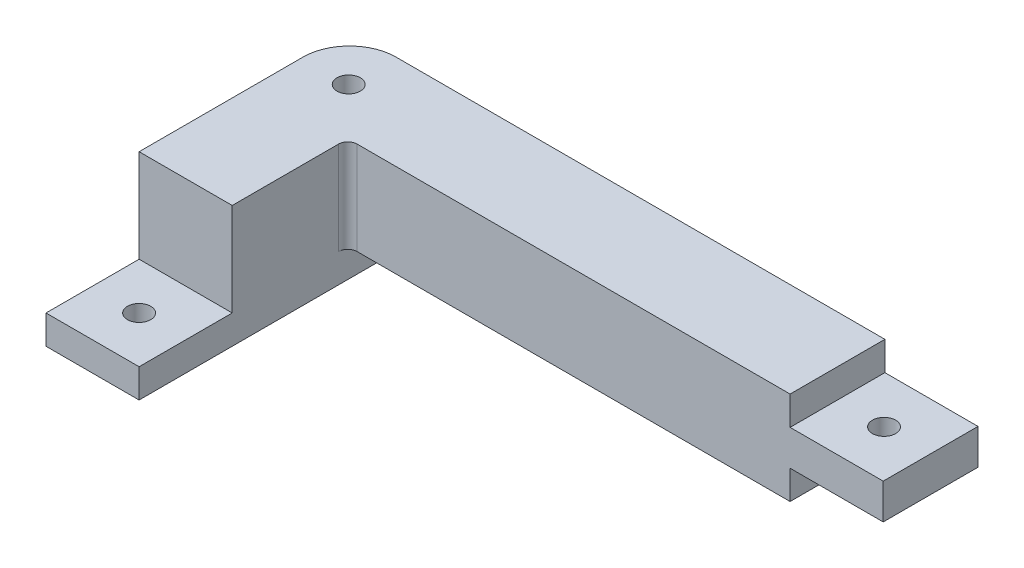
ISO-10303-21;
HEADER;
FILE_DESCRIPTION(('STEP AP214'),'2;1');
FILE_NAME('part.step','',(''),(''),'','','');
FILE_SCHEMA(('AUTOMOTIVE_DESIGN { 1 0 10303 214 1 1 1 1 }'));
ENDSEC;
DATA;
#1=APPLICATION_CONTEXT('core data for automotive mechanical design processes');
#2=APPLICATION_PROTOCOL_DEFINITION('international standard','automotive_design',2000,#1);
#3=PRODUCT_CONTEXT('',#1,'mechanical');
#4=PRODUCT('Part','Part','',(#3));
#5=PRODUCT_RELATED_PRODUCT_CATEGORY('part','',(#4));
#6=PRODUCT_DEFINITION_FORMATION('','',#4);
#7=PRODUCT_DEFINITION_CONTEXT('part definition',#1,'design');
#8=PRODUCT_DEFINITION('design','',#6,#7);
#9=PRODUCT_DEFINITION_SHAPE('','',#8);
#10=(LENGTH_UNIT() NAMED_UNIT(*) SI_UNIT(.MILLI.,.METRE.));
#11=(NAMED_UNIT(*) PLANE_ANGLE_UNIT() SI_UNIT($,.RADIAN.));
#12=(NAMED_UNIT(*) SI_UNIT($,.STERADIAN.) SOLID_ANGLE_UNIT());
#13=UNCERTAINTY_MEASURE_WITH_UNIT(LENGTH_MEASURE(1.E-05),#10,'distance_accuracy_value','');
#14=(GEOMETRIC_REPRESENTATION_CONTEXT(3) GLOBAL_UNCERTAINTY_ASSIGNED_CONTEXT((#13)) GLOBAL_UNIT_ASSIGNED_CONTEXT((#10,
#11,#12)) REPRESENTATION_CONTEXT('',''));
#15=CARTESIAN_POINT('',(0.,0.,0.));
#16=DIRECTION('',(0.,0.,1.));
#17=DIRECTION('',(1.,0.,0.));
#18=AXIS2_PLACEMENT_3D('',#15,#16,#17);
#19=CARTESIAN_POINT('',(147.000196891192,0.,0.));
#20=DIRECTION('',(-1.,0.,0.));
#21=DIRECTION('',(0.,0.,1.));
#22=AXIS2_PLACEMENT_3D('',#19,#20,#21);
#23=PLANE('',#22);
#24=DIRECTION('',(0.,0.,1.));
#25=VECTOR('',#24,1.);
#26=CARTESIAN_POINT('',(147.000196891192,25.4,0.));
#27=LINE('',#26,#25);
#28=CARTESIAN_POINT('',(147.000196891192,25.4,-25.8596347150259));
#29=VERTEX_POINT('',#28);
#30=CARTESIAN_POINT('',(147.000196891192,25.4,0.));
#31=VERTEX_POINT('',#30);
#32=EDGE_CURVE('E174',#29,#31,#27,.T.);
#33=ORIENTED_EDGE('',*,*,#32,.F.);
#34=DIRECTION('',(0.,1.,0.));
#35=VECTOR('',#34,1.);
#36=CARTESIAN_POINT('',(147.000196891192,33.274,-25.8596347150259));
#37=LINE('',#36,#35);
#38=CARTESIAN_POINT('',(147.000196891192,33.274,-25.8596347150259));
#39=VERTEX_POINT('',#38);
#40=EDGE_CURVE('E217',#29,#39,#37,.T.);
#41=ORIENTED_EDGE('',*,*,#40,.T.);
#42=DIRECTION('',(0.,0.,1.));
#43=VECTOR('',#42,1.);
#44=CARTESIAN_POINT('',(147.000196891192,33.274,-25.8596347150259));
#45=LINE('',#44,#43);
#46=CARTESIAN_POINT('',(147.000196891192,33.274,0.));
#47=VERTEX_POINT('',#46);
#48=EDGE_CURVE('E216',#39,#47,#45,.T.);
#49=ORIENTED_EDGE('',*,*,#48,.T.);
#50=DIRECTION('',(0.,-1.,0.));
#51=VECTOR('',#50,1.);
#52=CARTESIAN_POINT('',(147.000196891192,33.274,0.));
#53=LINE('',#52,#51);
#54=EDGE_CURVE('E220',#47,#31,#53,.T.);
#55=ORIENTED_EDGE('',*,*,#54,.T.);
#56=EDGE_LOOP('',(#33,#41,#49,#55));
#57=FACE_BOUND('',#56,.T.);
#58=ADVANCED_FACE('F45',(#57),#23,.F.);
#59=DIRECTION('',(0.,0.,-1.));
#60=VECTOR('',#59,1.);
#61=CARTESIAN_POINT('',(147.000196891192,15.748,0.));
#62=LINE('',#61,#60);
#63=CARTESIAN_POINT('',(147.000196891192,15.748,0.));
#64=VERTEX_POINT('',#63);
#65=CARTESIAN_POINT('',(147.000196891192,15.748,-25.8596347150259));
#66=VERTEX_POINT('',#65);
#67=EDGE_CURVE('E321',#64,#66,#62,.T.);
#68=ORIENTED_EDGE('',*,*,#67,.F.);
#69=CARTESIAN_POINT('',(147.000196891192,7.874,0.));
#70=VERTEX_POINT('',#69);
#71=EDGE_CURVE('E180',#64,#70,#53,.T.);
#72=ORIENTED_EDGE('',*,*,#71,.T.);
#73=DIRECTION('',(0.,0.,-1.));
#74=VECTOR('',#73,1.);
#75=CARTESIAN_POINT('',(147.000196891192,7.874,-25.8596347150259));
#76=LINE('',#75,#74);
#77=CARTESIAN_POINT('',(147.000196891192,7.874,-25.8596347150259));
#78=VERTEX_POINT('',#77);
#79=EDGE_CURVE('E223',#70,#78,#76,.T.);
#80=ORIENTED_EDGE('',*,*,#79,.T.);
#81=EDGE_CURVE('E213',#78,#66,#37,.T.);
#82=ORIENTED_EDGE('',*,*,#81,.T.);
#83=EDGE_LOOP('',(#68,#72,#80,#82));
#84=FACE_BOUND('',#83,.T.);
#85=ADVANCED_FACE('F357',(#84),#23,.F.);
#86=CARTESIAN_POINT('',(0.,33.274,0.));
#87=DIRECTION('',(0.,1.,0.));
#88=DIRECTION('',(0.,0.,1.));
#89=AXIS2_PLACEMENT_3D('',#86,#87,#88);
#90=PLANE('',#89);
#91=CARTESIAN_POINT('',(13.6501968911918,33.274,-12.929817357513));
#92=DIRECTION('',(0.,1.,0.));
#93=DIRECTION('',(0.,0.,1.));
#94=AXIS2_PLACEMENT_3D('',#91,#92,#93);
#95=CIRCLE('',#94,3.175);
#96=CARTESIAN_POINT('',(13.6501968911918,33.274,-9.75481735751296));
#97=VERTEX_POINT('',#96);
#98=EDGE_CURVE('E280',#97,#97,#95,.T.);
#99=ORIENTED_EDGE('',*,*,#98,.F.);
#100=EDGE_LOOP('',(#99));
#101=FACE_BOUND('',#100,.T.);
#102=DIRECTION('',(-1.,0.,0.));
#103=VECTOR('',#102,1.);
#104=CARTESIAN_POINT('',(26.3501968911917,33.274,-25.8596347150259));
#105=LINE('',#104,#103);
#106=CARTESIAN_POINT('',(13.6501968911917,33.274,-25.8596347150259));
#107=VERTEX_POINT('',#106);
#108=EDGE_CURVE('E243',#39,#107,#105,.T.);
#109=ORIENTED_EDGE('',*,*,#108,.T.);
#110=CARTESIAN_POINT('',(13.6501968911917,33.274,-13.1596347150259));
#111=DIRECTION('',(0.,1.,0.));
#112=DIRECTION('',(0.,0.,1.));
#113=AXIS2_PLACEMENT_3D('',#110,#111,#112);
#114=CIRCLE('',#113,12.7);
#115=CARTESIAN_POINT('',(0.950196891191725,33.274,-13.1596347150259));
#116=VERTEX_POINT('',#115);
#117=EDGE_CURVE('E290',#107,#116,#114,.T.);
#118=ORIENTED_EDGE('',*,*,#117,.T.);
#119=DIRECTION('',(0.,0.,1.));
#120=VECTOR('',#119,1.);
#121=CARTESIAN_POINT('',(0.950196891191725,33.274,56.9443652849741));
#122=LINE('',#121,#120);
#123=CARTESIAN_POINT('',(0.950196891191755,33.274,31.5443652849741));
#124=VERTEX_POINT('',#123);
#125=EDGE_CURVE('E248',#116,#124,#122,.T.);
#126=ORIENTED_EDGE('',*,*,#125,.T.);
#127=DIRECTION('',(-1.,0.,0.));
#128=VECTOR('',#127,1.);
#129=CARTESIAN_POINT('',(0.950196891191755,33.274,31.5443652849741));
#130=LINE('',#129,#128);
#131=CARTESIAN_POINT('',(26.3501968911917,33.274,31.5443652849741));
#132=VERTEX_POINT('',#131);
#133=EDGE_CURVE('E202',#132,#124,#130,.T.);
#134=ORIENTED_EDGE('',*,*,#133,.F.);
#135=DIRECTION('',(0.,0.,-1.));
#136=VECTOR('',#135,1.);
#137=CARTESIAN_POINT('',(26.3501968911917,33.274,56.9443652849741));
#138=LINE('',#137,#136);
#139=CARTESIAN_POINT('',(26.3501968911917,33.274,2.54));
#140=VERTEX_POINT('',#139);
#141=EDGE_CURVE('E240',#132,#140,#138,.T.);
#142=ORIENTED_EDGE('',*,*,#141,.T.);
#143=CARTESIAN_POINT('',(28.8901968911917,33.274,2.54));
#144=DIRECTION('',(0.,1.,0.));
#145=DIRECTION('',(0.,0.,1.));
#146=AXIS2_PLACEMENT_3D('',#143,#144,#145);
#147=CIRCLE('',#146,2.54);
#148=CARTESIAN_POINT('',(28.8901968911918,33.274,0.));
#149=VERTEX_POINT('',#148);
#150=EDGE_CURVE('E11',#140,#149,#147,.F.);
#151=ORIENTED_EDGE('',*,*,#150,.T.);
#152=DIRECTION('',(-1.,0.,0.));
#153=VECTOR('',#152,1.);
#154=CARTESIAN_POINT('',(147.000196891192,33.274,0.));
#155=LINE('',#154,#153);
#156=EDGE_CURVE('E236',#47,#149,#155,.T.);
#157=ORIENTED_EDGE('',*,*,#156,.F.);
#158=ORIENTED_EDGE('',*,*,#48,.F.);
#159=EDGE_LOOP('',(#109,#118,#126,#134,#142,#151,#157,#158));
#160=FACE_BOUND('',#159,.T.);
#161=ADVANCED_FACE('F308',(#101,#160),#90,.T.);
#162=CARTESIAN_POINT('',(26.3501968911917,33.274,56.9443652849741));
#163=DIRECTION('',(-1.,0.,0.));
#164=DIRECTION('',(0.,0.,1.));
#165=AXIS2_PLACEMENT_3D('',#162,#163,#164);
#166=PLANE('',#165);
#167=DIRECTION('',(0.,0.,-1.));
#168=VECTOR('',#167,1.);
#169=CARTESIAN_POINT('',(26.3501968911917,7.874,-25.8596347150259));
#170=LINE('',#169,#168);
#171=CARTESIAN_POINT('',(26.3501968911917,7.874,2.54));
#172=VERTEX_POINT('',#171);
#173=CARTESIAN_POINT('',(26.3501968911917,7.874,-25.8596347150259));
#174=VERTEX_POINT('',#173);
#175=EDGE_CURVE('E61',#172,#174,#170,.T.);
#176=ORIENTED_EDGE('',*,*,#175,.F.);
#177=DIRECTION('',(0.,-1.,0.));
#178=VECTOR('',#177,1.);
#179=CARTESIAN_POINT('',(26.3501968911917,33.274,2.54));
#180=LINE('',#179,#178);
#181=EDGE_CURVE('E66',#172,#140,#180,.F.);
#182=ORIENTED_EDGE('',*,*,#181,.T.);
#183=ORIENTED_EDGE('',*,*,#141,.F.);
#184=DIRECTION('',(0.,1.,0.));
#185=VECTOR('',#184,1.);
#186=CARTESIAN_POINT('',(26.3501968911918,33.274,31.5443652849741));
#187=LINE('',#186,#185);
#188=CARTESIAN_POINT('',(26.3501968911918,7.874,31.5443652849741));
#189=VERTEX_POINT('',#188);
#190=EDGE_CURVE('E199',#189,#132,#187,.T.);
#191=ORIENTED_EDGE('',*,*,#190,.F.);
#192=DIRECTION('',(0.,0.,1.));
#193=VECTOR('',#192,1.);
#194=CARTESIAN_POINT('',(26.3501968911918,7.874,31.5443652849741));
#195=LINE('',#194,#193);
#196=CARTESIAN_POINT('',(26.3501968911918,7.874,56.9443652849741));
#197=VERTEX_POINT('',#196);
#198=EDGE_CURVE('E207',#189,#197,#195,.T.);
#199=ORIENTED_EDGE('',*,*,#198,.T.);
#200=DIRECTION('',(0.,-1.,0.));
#201=VECTOR('',#200,1.);
#202=CARTESIAN_POINT('',(26.3501968911917,33.274,56.9443652849741));
#203=LINE('',#202,#201);
#204=CARTESIAN_POINT('',(26.3501968911917,0.,56.9443652849741));
#205=VERTEX_POINT('',#204);
#206=EDGE_CURVE('E251',#197,#205,#203,.T.);
#207=ORIENTED_EDGE('',*,*,#206,.T.);
#208=DIRECTION('',(0.,0.,-1.));
#209=VECTOR('',#208,1.);
#210=CARTESIAN_POINT('',(26.3501968911917,0.,56.9443652849741));
#211=LINE('',#210,#209);
#212=CARTESIAN_POINT('',(26.3501968911917,0.,-25.8596347150259));
#213=VERTEX_POINT('',#212);
#214=EDGE_CURVE('E239',#205,#213,#211,.T.);
#215=ORIENTED_EDGE('',*,*,#214,.T.);
#216=DIRECTION('',(0.,-1.,0.));
#217=VECTOR('',#216,1.);
#218=CARTESIAN_POINT('',(26.3501968911917,33.274,-25.8596347150259));
#219=LINE('',#218,#217);
#220=EDGE_CURVE('E271',#174,#213,#219,.T.);
#221=ORIENTED_EDGE('',*,*,#220,.F.);
#222=EDGE_LOOP('',(#176,#182,#183,#191,#199,#207,#215,#221));
#223=FACE_BOUND('',#222,.T.);
#224=ADVANCED_FACE('F356',(#223),#166,.F.);
#225=CARTESIAN_POINT('',(26.3501968911917,33.274,-25.8596347150259));
#226=DIRECTION('',(0.,0.,1.));
#227=DIRECTION('',(1.,0.,0.));
#228=AXIS2_PLACEMENT_3D('',#225,#226,#227);
#229=PLANE('',#228);
#230=DIRECTION('',(-1.,0.,0.));
#231=VECTOR('',#230,1.);
#232=CARTESIAN_POINT('',(26.3501968911917,0.,-25.8596347150259));
#233=LINE('',#232,#231);
#234=CARTESIAN_POINT('',(13.6501968911917,0.,-25.8596347150259));
#235=VERTEX_POINT('',#234);
#236=EDGE_CURVE('E255',#213,#235,#233,.T.);
#237=ORIENTED_EDGE('',*,*,#236,.T.);
#238=DIRECTION('',(0.,-1.,0.));
#239=VECTOR('',#238,1.);
#240=CARTESIAN_POINT('',(13.6501968911917,33.274,-25.8596347150259));
#241=LINE('',#240,#239);
#242=EDGE_CURVE('E287',#235,#107,#241,.F.);
#243=ORIENTED_EDGE('',*,*,#242,.T.);
#244=ORIENTED_EDGE('',*,*,#108,.F.);
#245=ORIENTED_EDGE('',*,*,#40,.F.);
#246=DIRECTION('',(-1.,0.,0.));
#247=VECTOR('',#246,1.);
#248=CARTESIAN_POINT('',(172.400196891192,25.4,-25.8596347150259));
#249=LINE('',#248,#247);
#250=CARTESIAN_POINT('',(172.400196891192,25.4,-25.8596347150259));
#251=VERTEX_POINT('',#250);
#252=EDGE_CURVE('E188',#251,#29,#249,.T.);
#253=ORIENTED_EDGE('',*,*,#252,.F.);
#254=DIRECTION('',(0.,1.,0.));
#255=VECTOR('',#254,1.);
#256=CARTESIAN_POINT('',(172.400196891192,25.4,-25.8596347150259));
#257=LINE('',#256,#255);
#258=CARTESIAN_POINT('',(172.400196891192,15.748,-25.8596347150259));
#259=VERTEX_POINT('',#258);
#260=EDGE_CURVE('E163',#259,#251,#257,.T.);
#261=ORIENTED_EDGE('',*,*,#260,.F.);
#262=DIRECTION('',(-1.,0.,0.));
#263=VECTOR('',#262,1.);
#264=CARTESIAN_POINT('',(172.400196891192,15.748,-25.8596347150259));
#265=LINE('',#264,#263);
#266=EDGE_CURVE('E159',#259,#66,#265,.T.);
#267=ORIENTED_EDGE('',*,*,#266,.T.);
#268=ORIENTED_EDGE('',*,*,#81,.F.);
#269=DIRECTION('',(-1.,0.,0.));
#270=VECTOR('',#269,1.);
#271=CARTESIAN_POINT('',(147.000196891192,7.874,-25.8596347150259));
#272=LINE('',#271,#270);
#273=EDGE_CURVE('E226',#78,#174,#272,.T.);
#274=ORIENTED_EDGE('',*,*,#273,.T.);
#275=ORIENTED_EDGE('',*,*,#220,.T.);
#276=EDGE_LOOP('',(#237,#243,#244,#245,#253,#261,#267,#268,#274,#275));
#277=FACE_BOUND('',#276,.T.);
#278=ADVANCED_FACE('F363',(#277),#229,.F.);
#279=CARTESIAN_POINT('',(0.950196891191725,33.274,56.9443652849741));
#280=DIRECTION('',(1.,0.,0.));
#281=DIRECTION('',(0.,0.,-1.));
#282=AXIS2_PLACEMENT_3D('',#279,#280,#281);
#283=PLANE('',#282);
#284=ORIENTED_EDGE('',*,*,#125,.F.);
#285=DIRECTION('',(0.,-1.,0.));
#286=VECTOR('',#285,1.);
#287=CARTESIAN_POINT('',(0.950196891191725,33.274,-13.1596347150259));
#288=LINE('',#287,#286);
#289=CARTESIAN_POINT('',(0.950196891191725,0.,-13.1596347150259));
#290=VERTEX_POINT('',#289);
#291=EDGE_CURVE('E274',#116,#290,#288,.T.);
#292=ORIENTED_EDGE('',*,*,#291,.T.);
#293=DIRECTION('',(0.,0.,1.));
#294=VECTOR('',#293,1.);
#295=CARTESIAN_POINT('',(0.950196891191725,0.,56.9443652849741));
#296=LINE('',#295,#294);
#297=CARTESIAN_POINT('',(0.950196891191725,0.,56.9443652849741));
#298=VERTEX_POINT('',#297);
#299=EDGE_CURVE('E259',#290,#298,#296,.T.);
#300=ORIENTED_EDGE('',*,*,#299,.T.);
#301=DIRECTION('',(0.,-1.,0.));
#302=VECTOR('',#301,1.);
#303=CARTESIAN_POINT('',(0.950196891191725,33.274,56.9443652849741));
#304=LINE('',#303,#302);
#305=CARTESIAN_POINT('',(0.950196891191758,7.874,56.9443652849741));
#306=VERTEX_POINT('',#305);
#307=EDGE_CURVE('E267',#306,#298,#304,.T.);
#308=ORIENTED_EDGE('',*,*,#307,.F.);
#309=DIRECTION('',(0.,0.,1.));
#310=VECTOR('',#309,1.);
#311=CARTESIAN_POINT('',(0.950196891191758,7.874,31.5443652849741));
#312=LINE('',#311,#310);
#313=CARTESIAN_POINT('',(0.950196891191758,7.874,31.5443652849741));
#314=VERTEX_POINT('',#313);
#315=EDGE_CURVE('E205',#314,#306,#312,.T.);
#316=ORIENTED_EDGE('',*,*,#315,.F.);
#317=DIRECTION('',(0.,-1.,0.));
#318=VECTOR('',#317,1.);
#319=CARTESIAN_POINT('',(0.950196891191755,33.274,31.5443652849741));
#320=LINE('',#319,#318);
#321=EDGE_CURVE('E186',#124,#314,#320,.T.);
#322=ORIENTED_EDGE('',*,*,#321,.F.);
#323=EDGE_LOOP('',(#284,#292,#300,#308,#316,#322));
#324=FACE_BOUND('',#323,.T.);
#325=ADVANCED_FACE('F390',(#324),#283,.F.);
#326=CARTESIAN_POINT('',(26.3501968911917,33.274,56.9443652849741));
#327=DIRECTION('',(0.,0.,-1.));
#328=DIRECTION('',(-1.,0.,0.));
#329=AXIS2_PLACEMENT_3D('',#326,#327,#328);
#330=PLANE('',#329);
#331=ORIENTED_EDGE('',*,*,#206,.F.);
#332=DIRECTION('',(1.,0.,0.));
#333=VECTOR('',#332,1.);
#334=CARTESIAN_POINT('',(0.950196891191758,7.874,56.9443652849741));
#335=LINE('',#334,#333);
#336=EDGE_CURVE('E182',#306,#197,#335,.T.);
#337=ORIENTED_EDGE('',*,*,#336,.F.);
#338=ORIENTED_EDGE('',*,*,#307,.T.);
#339=DIRECTION('',(1.,0.,0.));
#340=VECTOR('',#339,1.);
#341=CARTESIAN_POINT('',(26.3501968911917,0.,56.9443652849741));
#342=LINE('',#341,#340);
#343=EDGE_CURVE('E244',#298,#205,#342,.T.);
#344=ORIENTED_EDGE('',*,*,#343,.T.);
#345=EDGE_LOOP('',(#331,#337,#338,#344));
#346=FACE_BOUND('',#345,.T.);
#347=ADVANCED_FACE('F384',(#346),#330,.F.);
#348=CARTESIAN_POINT('',(0.,0.,0.));
#349=DIRECTION('',(0.,1.,0.));
#350=DIRECTION('',(0.,0.,1.));
#351=AXIS2_PLACEMENT_3D('',#348,#349,#350);
#352=PLANE('',#351);
#353=CARTESIAN_POINT('',(13.6501968911918,0.,-12.929817357513));
#354=DIRECTION('',(0.,1.,0.));
#355=DIRECTION('',(0.,0.,1.));
#356=AXIS2_PLACEMENT_3D('',#353,#354,#355);
#357=CIRCLE('',#356,3.175);
#358=CARTESIAN_POINT('',(13.6501968911918,0.,-9.75481735751296));
#359=VERTEX_POINT('',#358);
#360=EDGE_CURVE('E275',#359,#359,#357,.T.);
#361=ORIENTED_EDGE('',*,*,#360,.T.);
#362=EDGE_LOOP('',(#361));
#363=FACE_BOUND('',#362,.T.);
#364=CARTESIAN_POINT('',(13.6501968911918,0.,44.2443652849741));
#365=DIRECTION('',(0.,1.,0.));
#366=DIRECTION('',(0.,0.,1.));
#367=AXIS2_PLACEMENT_3D('',#364,#365,#366);
#368=CIRCLE('',#367,3.175);
#369=CARTESIAN_POINT('',(13.6501968911918,0.,47.4193652849741));
#370=VERTEX_POINT('',#369);
#371=EDGE_CURVE('E341',#370,#370,#368,.T.);
#372=ORIENTED_EDGE('',*,*,#371,.T.);
#373=EDGE_LOOP('',(#372));
#374=FACE_BOUND('',#373,.T.);
#375=ORIENTED_EDGE('',*,*,#299,.F.);
#376=CARTESIAN_POINT('',(13.6501968911917,0.,-13.1596347150259));
#377=DIRECTION('',(0.,1.,0.));
#378=DIRECTION('',(0.,0.,1.));
#379=AXIS2_PLACEMENT_3D('',#376,#377,#378);
#380=CIRCLE('',#379,12.7);
#381=EDGE_CURVE('E284',#290,#235,#380,.F.);
#382=ORIENTED_EDGE('',*,*,#381,.T.);
#383=ORIENTED_EDGE('',*,*,#236,.F.);
#384=ORIENTED_EDGE('',*,*,#214,.F.);
#385=ORIENTED_EDGE('',*,*,#343,.F.);
#386=EDGE_LOOP('',(#375,#382,#383,#384,#385));
#387=FACE_BOUND('',#386,.T.);
#388=ADVANCED_FACE('F380',(#363,#374,#387),#352,.F.);
#389=CARTESIAN_POINT('',(147.000196891192,33.274,0.));
#390=DIRECTION('',(0.,0.,-1.));
#391=DIRECTION('',(0.,1.,0.));
#392=AXIS2_PLACEMENT_3D('',#389,#390,#391);
#393=PLANE('',#392);
#394=ORIENTED_EDGE('',*,*,#156,.T.);
#395=DIRECTION('',(0.,-1.,0.));
#396=VECTOR('',#395,1.);
#397=CARTESIAN_POINT('',(28.8901968911917,7.874,0.));
#398=LINE('',#397,#396);
#399=CARTESIAN_POINT('',(28.8901968911918,7.874,0.));
#400=VERTEX_POINT('',#399);
#401=EDGE_CURVE('E293',#149,#400,#398,.T.);
#402=ORIENTED_EDGE('',*,*,#401,.T.);
#403=DIRECTION('',(-1.,0.,0.));
#404=VECTOR('',#403,1.);
#405=CARTESIAN_POINT('',(147.000196891192,7.874,0.));
#406=LINE('',#405,#404);
#407=EDGE_CURVE('E232',#70,#400,#406,.T.);
#408=ORIENTED_EDGE('',*,*,#407,.F.);
#409=ORIENTED_EDGE('',*,*,#71,.F.);
#410=DIRECTION('',(-1.,0.,0.));
#411=VECTOR('',#410,1.);
#412=CARTESIAN_POINT('',(172.400196891192,15.748,0.));
#413=LINE('',#412,#411);
#414=CARTESIAN_POINT('',(172.400196891192,15.748,0.));
#415=VERTEX_POINT('',#414);
#416=EDGE_CURVE('E157',#415,#64,#413,.T.);
#417=ORIENTED_EDGE('',*,*,#416,.F.);
#418=DIRECTION('',(0.,-1.,0.));
#419=VECTOR('',#418,1.);
#420=CARTESIAN_POINT('',(172.400196891192,25.4,0.));
#421=LINE('',#420,#419);
#422=CARTESIAN_POINT('',(172.400196891192,25.4,0.));
#423=VERTEX_POINT('',#422);
#424=EDGE_CURVE('E164',#423,#415,#421,.T.);
#425=ORIENTED_EDGE('',*,*,#424,.F.);
#426=DIRECTION('',(-1.,0.,0.));
#427=VECTOR('',#426,1.);
#428=CARTESIAN_POINT('',(172.400196891192,25.4,0.));
#429=LINE('',#428,#427);
#430=EDGE_CURVE('E312',#423,#31,#429,.T.);
#431=ORIENTED_EDGE('',*,*,#430,.T.);
#432=ORIENTED_EDGE('',*,*,#54,.F.);
#433=EDGE_LOOP('',(#394,#402,#408,#409,#417,#425,#431,#432));
#434=FACE_BOUND('',#433,.T.);
#435=ADVANCED_FACE('F178',(#434),#393,.F.);
#436=CARTESIAN_POINT('',(147.000196891192,7.874,-25.8596347150259));
#437=DIRECTION('',(0.,1.,0.));
#438=DIRECTION('',(0.,0.,1.));
#439=AXIS2_PLACEMENT_3D('',#436,#437,#438);
#440=PLANE('',#439);
#441=ORIENTED_EDGE('',*,*,#175,.T.);
#442=ORIENTED_EDGE('',*,*,#273,.F.);
#443=ORIENTED_EDGE('',*,*,#79,.F.);
#444=ORIENTED_EDGE('',*,*,#407,.T.);
#445=CARTESIAN_POINT('',(28.8901968911917,7.874,2.54));
#446=DIRECTION('',(0.,1.,0.));
#447=DIRECTION('',(0.,0.,1.));
#448=AXIS2_PLACEMENT_3D('',#445,#446,#447);
#449=CIRCLE('',#448,2.54);
#450=EDGE_CURVE('E54',#400,#172,#449,.T.);
#451=ORIENTED_EDGE('',*,*,#450,.T.);
#452=EDGE_LOOP('',(#441,#442,#443,#444,#451));
#453=FACE_BOUND('',#452,.T.);
#454=ADVANCED_FACE('F300',(#453),#440,.F.);
#455=CARTESIAN_POINT('',(0.950196891191758,7.874,31.5443652849741));
#456=DIRECTION('',(0.,-1.,0.));
#457=DIRECTION('',(0.,0.,-1.));
#458=AXIS2_PLACEMENT_3D('',#455,#456,#457);
#459=PLANE('',#458);
#460=CARTESIAN_POINT('',(13.6501968911918,7.874,44.2443652849741));
#461=DIRECTION('',(0.,1.,0.));
#462=DIRECTION('',(0.,0.,1.));
#463=AXIS2_PLACEMENT_3D('',#460,#461,#462);
#464=CIRCLE('',#463,3.175);
#465=CARTESIAN_POINT('',(13.6501968911918,7.874,47.4193652849741));
#466=VERTEX_POINT('',#465);
#467=EDGE_CURVE('E279',#466,#466,#464,.T.);
#468=ORIENTED_EDGE('',*,*,#467,.F.);
#469=EDGE_LOOP('',(#468));
#470=FACE_BOUND('',#469,.T.);
#471=ORIENTED_EDGE('',*,*,#336,.T.);
#472=ORIENTED_EDGE('',*,*,#198,.F.);
#473=DIRECTION('',(1.,0.,0.));
#474=VECTOR('',#473,1.);
#475=CARTESIAN_POINT('',(0.950196891191758,7.874,31.5443652849741));
#476=LINE('',#475,#474);
#477=EDGE_CURVE('E195',#314,#189,#476,.T.);
#478=ORIENTED_EDGE('',*,*,#477,.F.);
#479=ORIENTED_EDGE('',*,*,#315,.T.);
#480=EDGE_LOOP('',(#471,#472,#478,#479));
#481=FACE_BOUND('',#480,.T.);
#482=ADVANCED_FACE('F376',(#470,#481),#459,.F.);
#483=CARTESIAN_POINT('',(0.,0.,31.5443652849741));
#484=DIRECTION('',(0.,0.,1.));
#485=DIRECTION('',(1.,0.,0.));
#486=AXIS2_PLACEMENT_3D('',#483,#484,#485);
#487=PLANE('',#486);
#488=ORIENTED_EDGE('',*,*,#321,.T.);
#489=ORIENTED_EDGE('',*,*,#477,.T.);
#490=ORIENTED_EDGE('',*,*,#190,.T.);
#491=ORIENTED_EDGE('',*,*,#133,.T.);
#492=EDGE_LOOP('',(#488,#489,#490,#491));
#493=FACE_BOUND('',#492,.T.);
#494=ADVANCED_FACE('F417',(#493),#487,.T.);
#495=CARTESIAN_POINT('',(172.400196891192,15.748,0.));
#496=DIRECTION('',(0.,1.,0.));
#497=DIRECTION('',(0.,0.,1.));
#498=AXIS2_PLACEMENT_3D('',#495,#496,#497);
#499=PLANE('',#498);
#500=CARTESIAN_POINT('',(159.700196891192,15.748,-12.929817357513));
#501=DIRECTION('',(0.,1.,0.));
#502=DIRECTION('',(0.,0.,1.));
#503=AXIS2_PLACEMENT_3D('',#500,#501,#502);
#504=CIRCLE('',#503,3.175);
#505=CARTESIAN_POINT('',(159.700196891192,15.748,-9.75481735751296));
#506=VERTEX_POINT('',#505);
#507=EDGE_CURVE('E324',#506,#506,#504,.T.);
#508=ORIENTED_EDGE('',*,*,#507,.T.);
#509=EDGE_LOOP('',(#508));
#510=FACE_BOUND('',#509,.T.);
#511=ORIENTED_EDGE('',*,*,#67,.T.);
#512=ORIENTED_EDGE('',*,*,#266,.F.);
#513=DIRECTION('',(0.,0.,-1.));
#514=VECTOR('',#513,1.);
#515=CARTESIAN_POINT('',(172.400196891192,15.748,0.));
#516=LINE('',#515,#514);
#517=EDGE_CURVE('E152',#415,#259,#516,.T.);
#518=ORIENTED_EDGE('',*,*,#517,.F.);
#519=ORIENTED_EDGE('',*,*,#416,.T.);
#520=EDGE_LOOP('',(#511,#512,#518,#519));
#521=FACE_BOUND('',#520,.T.);
#522=ADVANCED_FACE('F155',(#510,#521),#499,.F.);
#523=CARTESIAN_POINT('',(172.400196891192,25.4,0.));
#524=DIRECTION('',(0.,-1.,0.));
#525=DIRECTION('',(0.,0.,-1.));
#526=AXIS2_PLACEMENT_3D('',#523,#524,#525);
#527=PLANE('',#526);
#528=CARTESIAN_POINT('',(159.700196891192,25.4,-12.929817357513));
#529=DIRECTION('',(0.,1.,0.));
#530=DIRECTION('',(0.,0.,1.));
#531=AXIS2_PLACEMENT_3D('',#528,#529,#530);
#532=CIRCLE('',#531,3.175);
#533=CARTESIAN_POINT('',(159.700196891192,25.4,-9.75481735751296));
#534=VERTEX_POINT('',#533);
#535=EDGE_CURVE('E337',#534,#534,#532,.T.);
#536=ORIENTED_EDGE('',*,*,#535,.F.);
#537=EDGE_LOOP('',(#536));
#538=FACE_BOUND('',#537,.T.);
#539=ORIENTED_EDGE('',*,*,#32,.T.);
#540=ORIENTED_EDGE('',*,*,#430,.F.);
#541=DIRECTION('',(0.,0.,1.));
#542=VECTOR('',#541,1.);
#543=CARTESIAN_POINT('',(172.400196891192,25.4,0.));
#544=LINE('',#543,#542);
#545=EDGE_CURVE('E169',#251,#423,#544,.T.);
#546=ORIENTED_EDGE('',*,*,#545,.F.);
#547=ORIENTED_EDGE('',*,*,#252,.T.);
#548=EDGE_LOOP('',(#539,#540,#546,#547));
#549=FACE_BOUND('',#548,.T.);
#550=ADVANCED_FACE('F318',(#538,#549),#527,.F.);
#551=CARTESIAN_POINT('',(172.400196891192,0.,0.));
#552=DIRECTION('',(1.,0.,0.));
#553=DIRECTION('',(0.,0.,-1.));
#554=AXIS2_PLACEMENT_3D('',#551,#552,#553);
#555=PLANE('',#554);
#556=ORIENTED_EDGE('',*,*,#424,.T.);
#557=ORIENTED_EDGE('',*,*,#517,.T.);
#558=ORIENTED_EDGE('',*,*,#260,.T.);
#559=ORIENTED_EDGE('',*,*,#545,.T.);
#560=EDGE_LOOP('',(#556,#557,#558,#559));
#561=FACE_BOUND('',#560,.T.);
#562=ADVANCED_FACE('F167',(#561),#555,.T.);
#563=CARTESIAN_POINT('',(159.700196891192,-16.002,-12.929817357513));
#564=DIRECTION('',(0.,1.,0.));
#565=DIRECTION('',(0.,0.,1.));
#566=AXIS2_PLACEMENT_3D('',#563,#564,#565);
#567=CYLINDRICAL_SURFACE('',#566,3.175);
#568=ORIENTED_EDGE('',*,*,#535,.T.);
#569=EDGE_LOOP('',(#568));
#570=FACE_BOUND('',#569,.T.);
#571=ORIENTED_EDGE('',*,*,#507,.F.);
#572=EDGE_LOOP('',(#571));
#573=FACE_BOUND('',#572,.T.);
#574=ADVANCED_FACE('F438',(#570,#573),#567,.F.);
#575=CARTESIAN_POINT('',(13.6501968911918,-17.526,44.2443652849741));
#576=DIRECTION('',(0.,1.,0.));
#577=DIRECTION('',(0.,0.,1.));
#578=AXIS2_PLACEMENT_3D('',#575,#576,#577);
#579=CYLINDRICAL_SURFACE('',#578,3.175);
#580=ORIENTED_EDGE('',*,*,#467,.T.);
#581=EDGE_LOOP('',(#580));
#582=FACE_BOUND('',#581,.T.);
#583=ORIENTED_EDGE('',*,*,#371,.F.);
#584=EDGE_LOOP('',(#583));
#585=FACE_BOUND('',#584,.T.);
#586=ADVANCED_FACE('F405',(#582,#585),#579,.F.);
#587=CARTESIAN_POINT('',(13.6501968911918,-8.128,-12.929817357513));
#588=DIRECTION('',(0.,1.,0.));
#589=DIRECTION('',(0.,0.,1.));
#590=AXIS2_PLACEMENT_3D('',#587,#588,#589);
#591=CYLINDRICAL_SURFACE('',#590,3.175);
#592=ORIENTED_EDGE('',*,*,#98,.T.);
#593=EDGE_LOOP('',(#592));
#594=FACE_BOUND('',#593,.T.);
#595=ORIENTED_EDGE('',*,*,#360,.F.);
#596=EDGE_LOOP('',(#595));
#597=FACE_BOUND('',#596,.T.);
#598=ADVANCED_FACE('F352',(#594,#597),#591,.F.);
#599=CARTESIAN_POINT('',(13.6501968911917,33.274,-13.1596347150259));
#600=DIRECTION('',(0.,-1.,0.));
#601=DIRECTION('',(0.,0.,-1.));
#602=AXIS2_PLACEMENT_3D('',#599,#600,#601);
#603=CYLINDRICAL_SURFACE('',#602,12.7);
#604=ORIENTED_EDGE('',*,*,#117,.F.);
#605=ORIENTED_EDGE('',*,*,#242,.F.);
#606=ORIENTED_EDGE('',*,*,#381,.F.);
#607=ORIENTED_EDGE('',*,*,#291,.F.);
#608=EDGE_LOOP('',(#604,#605,#606,#607));
#609=FACE_BOUND('',#608,.T.);
#610=ADVANCED_FACE('F399',(#609),#603,.T.);
#611=CARTESIAN_POINT('',(28.8901968911917,33.274,2.54));
#612=DIRECTION('',(0.,1.,0.));
#613=DIRECTION('',(0.,0.,1.));
#614=AXIS2_PLACEMENT_3D('',#611,#612,#613);
#615=CYLINDRICAL_SURFACE('',#614,2.54);
#616=ORIENTED_EDGE('',*,*,#150,.F.);
#617=ORIENTED_EDGE('',*,*,#181,.F.);
#618=ORIENTED_EDGE('',*,*,#450,.F.);
#619=ORIENTED_EDGE('',*,*,#401,.F.);
#620=EDGE_LOOP('',(#616,#617,#618,#619));
#621=FACE_BOUND('',#620,.T.);
#622=ADVANCED_FACE('F47',(#621),#615,.F.);
#623=CLOSED_SHELL('',(#58,#85,#161,#224,#278,#325,#347,#388,#435,#454,#482,#494,#522,#550,#562,
#574,#586,#598,#610,#622));
#624=MANIFOLD_SOLID_BREP('B2',#623);
#625=ADVANCED_BREP_SHAPE_REPRESENTATION('',(#18,#624),#14);
#626=SHAPE_DEFINITION_REPRESENTATION(#9,#625);
ENDSEC;
END-ISO-10303-21;
